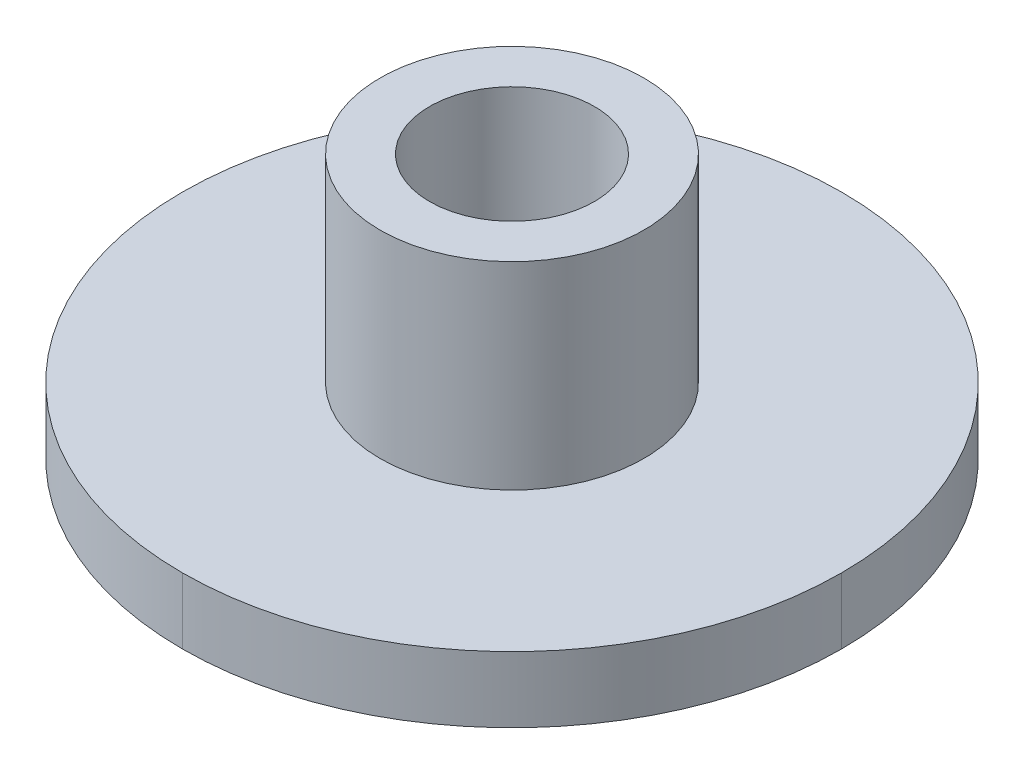
ISO-10303-21;
HEADER;
FILE_DESCRIPTION(('STEP AP214'),'2;1');
FILE_NAME('part.step','',(''),(''),'','','');
FILE_SCHEMA(('AUTOMOTIVE_DESIGN { 1 0 10303 214 1 1 1 1 }'));
ENDSEC;
DATA;
#1=APPLICATION_CONTEXT('core data for automotive mechanical design processes');
#2=APPLICATION_PROTOCOL_DEFINITION('international standard','automotive_design',2000,#1);
#3=PRODUCT_CONTEXT('',#1,'mechanical');
#4=PRODUCT('Part','Part','',(#3));
#5=PRODUCT_RELATED_PRODUCT_CATEGORY('part','',(#4));
#6=PRODUCT_DEFINITION_FORMATION('','',#4);
#7=PRODUCT_DEFINITION_CONTEXT('part definition',#1,'design');
#8=PRODUCT_DEFINITION('design','',#6,#7);
#9=PRODUCT_DEFINITION_SHAPE('','',#8);
#10=(LENGTH_UNIT() NAMED_UNIT(*) SI_UNIT(.MILLI.,.METRE.));
#11=(NAMED_UNIT(*) PLANE_ANGLE_UNIT() SI_UNIT($,.RADIAN.));
#12=(NAMED_UNIT(*) SI_UNIT($,.STERADIAN.) SOLID_ANGLE_UNIT());
#13=UNCERTAINTY_MEASURE_WITH_UNIT(LENGTH_MEASURE(1.E-05),#10,'distance_accuracy_value','');
#14=(GEOMETRIC_REPRESENTATION_CONTEXT(3) GLOBAL_UNCERTAINTY_ASSIGNED_CONTEXT((#13)) GLOBAL_UNIT_ASSIGNED_CONTEXT((#10,
#11,#12)) REPRESENTATION_CONTEXT('',''));
#15=CARTESIAN_POINT('',(0.,0.,0.));
#16=DIRECTION('',(0.,0.,1.));
#17=DIRECTION('',(1.,0.,0.));
#18=AXIS2_PLACEMENT_3D('',#15,#16,#17);
#19=CARTESIAN_POINT('',(0.,4.,-40.));
#20=DIRECTION('',(0.,-1.,0.));
#21=DIRECTION('',(0.,0.,-1.));
#22=AXIS2_PLACEMENT_3D('',#19,#20,#21);
#23=PLANE('',#22);
#24=CARTESIAN_POINT('',(20.,4.,-20.));
#25=DIRECTION('',(0.,-1.,0.));
#26=DIRECTION('',(0.,0.,-1.));
#27=AXIS2_PLACEMENT_3D('',#24,#25,#26);
#28=CIRCLE('',#27,20.);
#29=CARTESIAN_POINT('',(0.,4.,-20.));
#30=VERTEX_POINT('',#29);
#31=CARTESIAN_POINT('',(20.,4.,0.));
#32=VERTEX_POINT('',#31);
#33=EDGE_CURVE('E40',#30,#32,#28,.F.);
#34=ORIENTED_EDGE('',*,*,#33,.T.);
#35=CARTESIAN_POINT('',(20.,4.,-20.));
#36=DIRECTION('',(0.,-1.,0.));
#37=DIRECTION('',(0.,0.,-1.));
#38=AXIS2_PLACEMENT_3D('',#35,#36,#37);
#39=CIRCLE('',#38,20.);
#40=CARTESIAN_POINT('',(40.,4.,-20.));
#41=VERTEX_POINT('',#40);
#42=EDGE_CURVE('E11',#32,#41,#39,.F.);
#43=ORIENTED_EDGE('',*,*,#42,.T.);
#44=CARTESIAN_POINT('',(20.,4.,-20.));
#45=DIRECTION('',(0.,-1.,0.));
#46=DIRECTION('',(0.,0.,-1.));
#47=AXIS2_PLACEMENT_3D('',#44,#45,#46);
#48=CIRCLE('',#47,20.);
#49=CARTESIAN_POINT('',(20.,4.,-40.));
#50=VERTEX_POINT('',#49);
#51=EDGE_CURVE('E47',#41,#50,#48,.F.);
#52=ORIENTED_EDGE('',*,*,#51,.T.);
#53=CARTESIAN_POINT('',(20.,4.,-20.));
#54=DIRECTION('',(0.,-1.,0.));
#55=DIRECTION('',(0.,0.,-1.));
#56=AXIS2_PLACEMENT_3D('',#53,#54,#55);
#57=CIRCLE('',#56,20.);
#58=EDGE_CURVE('E104',#50,#30,#57,.F.);
#59=ORIENTED_EDGE('',*,*,#58,.T.);
#60=EDGE_LOOP('',(#34,#43,#52,#59));
#61=FACE_BOUND('',#60,.T.);
#62=CARTESIAN_POINT('',(20.,4.,-20.));
#63=DIRECTION('',(0.,-1.,0.));
#64=DIRECTION('',(0.,0.,-1.));
#65=AXIS2_PLACEMENT_3D('',#62,#63,#64);
#66=CIRCLE('',#65,8.);
#67=CARTESIAN_POINT('',(20.,4.,-28.));
#68=VERTEX_POINT('',#67);
#69=EDGE_CURVE('E109',#68,#68,#66,.F.);
#70=ORIENTED_EDGE('',*,*,#69,.F.);
#71=EDGE_LOOP('',(#70));
#72=FACE_BOUND('',#71,.T.);
#73=ADVANCED_FACE('F31',(#61,#72),#23,.F.);
#74=CARTESIAN_POINT('',(0.,0.,-40.));
#75=DIRECTION('',(0.,-1.,0.));
#76=DIRECTION('',(0.,0.,-1.));
#77=AXIS2_PLACEMENT_3D('',#74,#75,#76);
#78=PLANE('',#77);
#79=CARTESIAN_POINT('',(20.,0.,-20.));
#80=DIRECTION('',(0.,-1.,0.));
#81=DIRECTION('',(0.,0.,-1.));
#82=AXIS2_PLACEMENT_3D('',#79,#80,#81);
#83=CIRCLE('',#82,20.);
#84=CARTESIAN_POINT('',(20.,0.,-40.));
#85=VERTEX_POINT('',#84);
#86=CARTESIAN_POINT('',(40.,0.,-20.));
#87=VERTEX_POINT('',#86);
#88=EDGE_CURVE('E91',#85,#87,#83,.T.);
#89=ORIENTED_EDGE('',*,*,#88,.T.);
#90=CARTESIAN_POINT('',(20.,0.,-20.));
#91=DIRECTION('',(0.,-1.,0.));
#92=DIRECTION('',(0.,0.,-1.));
#93=AXIS2_PLACEMENT_3D('',#90,#91,#92);
#94=CIRCLE('',#93,20.);
#95=CARTESIAN_POINT('',(20.,0.,0.));
#96=VERTEX_POINT('',#95);
#97=EDGE_CURVE('E80',#87,#96,#94,.T.);
#98=ORIENTED_EDGE('',*,*,#97,.T.);
#99=CARTESIAN_POINT('',(20.,0.,-20.));
#100=DIRECTION('',(0.,-1.,0.));
#101=DIRECTION('',(0.,0.,-1.));
#102=AXIS2_PLACEMENT_3D('',#99,#100,#101);
#103=CIRCLE('',#102,20.);
#104=CARTESIAN_POINT('',(0.,0.,-20.));
#105=VERTEX_POINT('',#104);
#106=EDGE_CURVE('E75',#96,#105,#103,.T.);
#107=ORIENTED_EDGE('',*,*,#106,.T.);
#108=CARTESIAN_POINT('',(20.,0.,-20.));
#109=DIRECTION('',(0.,-1.,0.));
#110=DIRECTION('',(0.,0.,-1.));
#111=AXIS2_PLACEMENT_3D('',#108,#109,#110);
#112=CIRCLE('',#111,20.);
#113=EDGE_CURVE('E78',#105,#85,#112,.T.);
#114=ORIENTED_EDGE('',*,*,#113,.T.);
#115=EDGE_LOOP('',(#89,#98,#107,#114));
#116=FACE_BOUND('',#115,.T.);
#117=ADVANCED_FACE('F77',(#116),#78,.T.);
#118=CARTESIAN_POINT('',(20.,16.,-20.));
#119=DIRECTION('',(0.,1.,0.));
#120=DIRECTION('',(0.,0.,1.));
#121=AXIS2_PLACEMENT_3D('',#118,#119,#120);
#122=PLANE('',#121);
#123=CARTESIAN_POINT('',(20.,16.,-20.));
#124=DIRECTION('',(0.,1.,0.));
#125=DIRECTION('',(0.,0.,1.));
#126=AXIS2_PLACEMENT_3D('',#123,#124,#125);
#127=CIRCLE('',#126,8.);
#128=CARTESIAN_POINT('',(20.,16.,-12.));
#129=VERTEX_POINT('',#128);
#130=EDGE_CURVE('E112',#129,#129,#127,.T.);
#131=ORIENTED_EDGE('',*,*,#130,.T.);
#132=EDGE_LOOP('',(#131));
#133=FACE_BOUND('',#132,.T.);
#134=CARTESIAN_POINT('',(20.,16.,-20.));
#135=DIRECTION('',(0.,1.,0.));
#136=DIRECTION('',(0.,0.,1.));
#137=AXIS2_PLACEMENT_3D('',#134,#135,#136);
#138=CIRCLE('',#137,5.);
#139=CARTESIAN_POINT('',(20.,16.,-15.));
#140=VERTEX_POINT('',#139);
#141=EDGE_CURVE('E96',#140,#140,#138,.T.);
#142=ORIENTED_EDGE('',*,*,#141,.F.);
#143=EDGE_LOOP('',(#142));
#144=FACE_BOUND('',#143,.T.);
#145=ADVANCED_FACE('F121',(#133,#144),#122,.T.);
#146=CARTESIAN_POINT('',(20.,16.,-20.));
#147=DIRECTION('',(0.,-1.,0.));
#148=DIRECTION('',(0.,0.,-1.));
#149=AXIS2_PLACEMENT_3D('',#146,#147,#148);
#150=CYLINDRICAL_SURFACE('',#149,8.);
#151=ORIENTED_EDGE('',*,*,#130,.F.);
#152=EDGE_LOOP('',(#151));
#153=FACE_BOUND('',#152,.T.);
#154=ORIENTED_EDGE('',*,*,#69,.T.);
#155=EDGE_LOOP('',(#154));
#156=FACE_BOUND('',#155,.T.);
#157=ADVANCED_FACE('F123',(#153,#156),#150,.T.);
#158=CARTESIAN_POINT('',(20.,16.,-20.));
#159=DIRECTION('',(0.,-1.,0.));
#160=DIRECTION('',(0.,0.,-1.));
#161=AXIS2_PLACEMENT_3D('',#158,#159,#160);
#162=CYLINDRICAL_SURFACE('',#161,5.);
#163=ORIENTED_EDGE('',*,*,#141,.T.);
#164=EDGE_LOOP('',(#163));
#165=FACE_BOUND('',#164,.T.);
#166=CARTESIAN_POINT('',(20.,4.,-20.));
#167=DIRECTION('',(0.,1.,0.));
#168=DIRECTION('',(0.,0.,1.));
#169=AXIS2_PLACEMENT_3D('',#166,#167,#168);
#170=CIRCLE('',#169,5.);
#171=CARTESIAN_POINT('',(20.,4.,-15.));
#172=VERTEX_POINT('',#171);
#173=EDGE_CURVE('E94',#172,#172,#170,.T.);
#174=ORIENTED_EDGE('',*,*,#173,.F.);
#175=EDGE_LOOP('',(#174));
#176=FACE_BOUND('',#175,.T.);
#177=ADVANCED_FACE('F118',(#165,#176),#162,.F.);
#178=ORIENTED_EDGE('',*,*,#173,.T.);
#179=EDGE_LOOP('',(#178));
#180=FACE_BOUND('',#179,.T.);
#181=ADVANCED_FACE('F136',(#180),#23,.F.);
#182=CARTESIAN_POINT('',(20.,4.,-20.));
#183=DIRECTION('',(0.,-1.,0.));
#184=DIRECTION('',(0.,0.,-1.));
#185=AXIS2_PLACEMENT_3D('',#182,#183,#184);
#186=CYLINDRICAL_SURFACE('',#185,20.);
#187=DIRECTION('',(0.,-1.,0.));
#188=VECTOR('',#187,1.);
#189=CARTESIAN_POINT('',(20.,4.,-40.));
#190=LINE('',#189,#188);
#191=EDGE_CURVE('E89',#85,#50,#190,.F.);
#192=ORIENTED_EDGE('',*,*,#191,.F.);
#193=ORIENTED_EDGE('',*,*,#113,.F.);
#194=DIRECTION('',(0.,-1.,0.));
#195=VECTOR('',#194,1.);
#196=CARTESIAN_POINT('',(0.,4.,-20.));
#197=LINE('',#196,#195);
#198=EDGE_CURVE('E35',#30,#105,#197,.T.);
#199=ORIENTED_EDGE('',*,*,#198,.F.);
#200=ORIENTED_EDGE('',*,*,#58,.F.);
#201=EDGE_LOOP('',(#192,#193,#199,#200));
#202=FACE_BOUND('',#201,.T.);
#203=ADVANCED_FACE('F33',(#202),#186,.T.);
#204=CARTESIAN_POINT('',(20.,4.,-20.));
#205=DIRECTION('',(0.,-1.,0.));
#206=DIRECTION('',(0.,0.,-1.));
#207=AXIS2_PLACEMENT_3D('',#204,#205,#206);
#208=CYLINDRICAL_SURFACE('',#207,20.);
#209=ORIENTED_EDGE('',*,*,#198,.T.);
#210=ORIENTED_EDGE('',*,*,#106,.F.);
#211=DIRECTION('',(0.,-1.,0.));
#212=VECTOR('',#211,1.);
#213=CARTESIAN_POINT('',(20.,4.,0.));
#214=LINE('',#213,#212);
#215=EDGE_CURVE('E98',#32,#96,#214,.T.);
#216=ORIENTED_EDGE('',*,*,#215,.F.);
#217=ORIENTED_EDGE('',*,*,#33,.F.);
#218=EDGE_LOOP('',(#209,#210,#216,#217));
#219=FACE_BOUND('',#218,.T.);
#220=ADVANCED_FACE('F93',(#219),#208,.T.);
#221=CARTESIAN_POINT('',(20.,4.,-20.));
#222=DIRECTION('',(0.,-1.,0.));
#223=DIRECTION('',(0.,0.,-1.));
#224=AXIS2_PLACEMENT_3D('',#221,#222,#223);
#225=CYLINDRICAL_SURFACE('',#224,20.);
#226=ORIENTED_EDGE('',*,*,#191,.T.);
#227=ORIENTED_EDGE('',*,*,#51,.F.);
#228=DIRECTION('',(0.,-1.,0.));
#229=VECTOR('',#228,1.);
#230=CARTESIAN_POINT('',(40.,4.,-20.));
#231=LINE('',#230,#229);
#232=EDGE_CURVE('E55',#87,#41,#231,.F.);
#233=ORIENTED_EDGE('',*,*,#232,.F.);
#234=ORIENTED_EDGE('',*,*,#88,.F.);
#235=EDGE_LOOP('',(#226,#227,#233,#234));
#236=FACE_BOUND('',#235,.T.);
#237=ADVANCED_FACE('F186',(#236),#225,.T.);
#238=CARTESIAN_POINT('',(20.,4.,-20.));
#239=DIRECTION('',(0.,-1.,0.));
#240=DIRECTION('',(0.,0.,-1.));
#241=AXIS2_PLACEMENT_3D('',#238,#239,#240);
#242=CYLINDRICAL_SURFACE('',#241,20.);
#243=ORIENTED_EDGE('',*,*,#42,.F.);
#244=ORIENTED_EDGE('',*,*,#215,.T.);
#245=ORIENTED_EDGE('',*,*,#97,.F.);
#246=ORIENTED_EDGE('',*,*,#232,.T.);
#247=EDGE_LOOP('',(#243,#244,#245,#246));
#248=FACE_BOUND('',#247,.T.);
#249=ADVANCED_FACE('F194',(#248),#242,.T.);
#250=CLOSED_SHELL('',(#73,#117,#145,#157,#177,#181,#203,#220,#237,#249));
#251=MANIFOLD_SOLID_BREP('B2',#250);
#252=ADVANCED_BREP_SHAPE_REPRESENTATION('',(#18,#251),#14);
#253=SHAPE_DEFINITION_REPRESENTATION(#9,#252);
ENDSEC;
END-ISO-10303-21;
